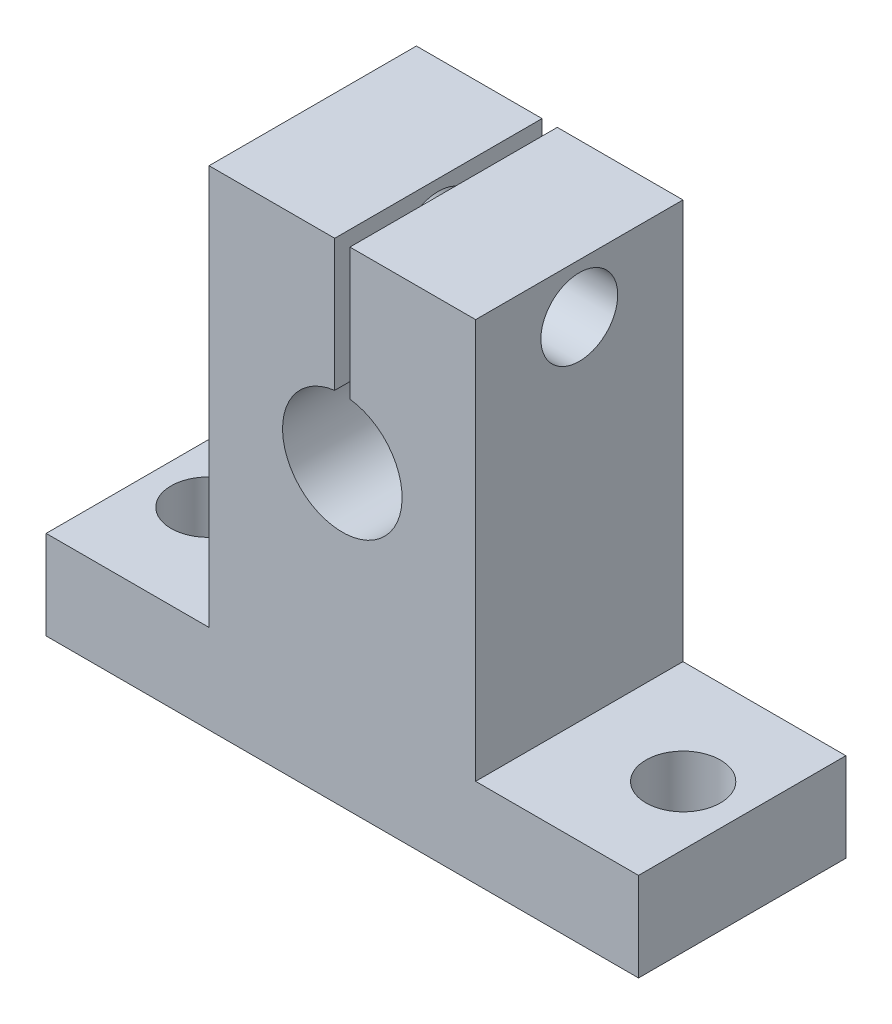
ISO-10303-21;
HEADER;
FILE_DESCRIPTION(('STEP AP214'),'2;1');
FILE_NAME('part.step','',(''),(''),'','','');
FILE_SCHEMA(('AUTOMOTIVE_DESIGN { 1 0 10303 214 1 1 1 1 }'));
ENDSEC;
DATA;
#1=APPLICATION_CONTEXT('core data for automotive mechanical design processes');
#2=APPLICATION_PROTOCOL_DEFINITION('international standard','automotive_design',2000,#1);
#3=PRODUCT_CONTEXT('',#1,'mechanical');
#4=PRODUCT('Part','Part','',(#3));
#5=PRODUCT_RELATED_PRODUCT_CATEGORY('part','',(#4));
#6=PRODUCT_DEFINITION_FORMATION('','',#4);
#7=PRODUCT_DEFINITION_CONTEXT('part definition',#1,'design');
#8=PRODUCT_DEFINITION('design','',#6,#7);
#9=PRODUCT_DEFINITION_SHAPE('','',#8);
#10=(LENGTH_UNIT() NAMED_UNIT(*) SI_UNIT(.MILLI.,.METRE.));
#11=(NAMED_UNIT(*) PLANE_ANGLE_UNIT() SI_UNIT($,.RADIAN.));
#12=(NAMED_UNIT(*) SI_UNIT($,.STERADIAN.) SOLID_ANGLE_UNIT());
#13=UNCERTAINTY_MEASURE_WITH_UNIT(LENGTH_MEASURE(1.E-05),#10,'distance_accuracy_value','');
#14=(GEOMETRIC_REPRESENTATION_CONTEXT(3) GLOBAL_UNCERTAINTY_ASSIGNED_CONTEXT((#13)) GLOBAL_UNIT_ASSIGNED_CONTEXT((#10,
#11,#12)) REPRESENTATION_CONTEXT('',''));
#15=CARTESIAN_POINT('',(0.,0.,0.));
#16=DIRECTION('',(0.,0.,1.));
#17=DIRECTION('',(1.,0.,0.));
#18=AXIS2_PLACEMENT_3D('',#15,#16,#17);
#19=CARTESIAN_POINT('',(-2.00038617608948,17.6991691104594,14.));
#20=DIRECTION('',(0.,1.,0.));
#21=DIRECTION('',(0.,0.,1.));
#22=AXIS2_PLACEMENT_3D('',#19,#20,#21);
#23=PLANE('',#22);
#24=DIRECTION('',(0.,0.,-1.));
#25=VECTOR('',#24,1.);
#26=CARTESIAN_POINT('',(7.51407649357905,17.6991691104594,14.));
#27=LINE('',#26,#25);
#28=CARTESIAN_POINT('',(7.51407649357905,17.6991691104594,14.));
#29=VERTEX_POINT('',#28);
#30=CARTESIAN_POINT('',(7.51407649357905,17.6991691104594,0.));
#31=VERTEX_POINT('',#30);
#32=EDGE_CURVE('E216',#29,#31,#27,.T.);
#33=ORIENTED_EDGE('',*,*,#32,.F.);
#34=DIRECTION('',(1.,0.,0.));
#35=VECTOR('',#34,1.);
#36=CARTESIAN_POINT('',(-2.00038617608948,17.6991691104594,14.));
#37=LINE('',#36,#35);
#38=CARTESIAN_POINT('',(15.9996138239105,17.6991691104594,14.));
#39=VERTEX_POINT('',#38);
#40=EDGE_CURVE('E132',#29,#39,#37,.T.);
#41=ORIENTED_EDGE('',*,*,#40,.T.);
#42=DIRECTION('',(0.,0.,-1.));
#43=VECTOR('',#42,1.);
#44=CARTESIAN_POINT('',(15.9996138239105,17.6991691104594,14.));
#45=LINE('',#44,#43);
#46=CARTESIAN_POINT('',(15.9996138239105,17.6991691104594,0.));
#47=VERTEX_POINT('',#46);
#48=EDGE_CURVE('E198',#39,#47,#45,.T.);
#49=ORIENTED_EDGE('',*,*,#48,.T.);
#50=DIRECTION('',(1.,0.,0.));
#51=VECTOR('',#50,1.);
#52=CARTESIAN_POINT('',(-2.00038617608948,17.6991691104594,0.));
#53=LINE('',#52,#51);
#54=EDGE_CURVE('E176',#31,#47,#53,.T.);
#55=ORIENTED_EDGE('',*,*,#54,.F.);
#56=EDGE_LOOP('',(#33,#41,#49,#55));
#57=FACE_BOUND('',#56,.T.);
#58=ADVANCED_FACE('F32',(#57),#23,.T.);
#59=CARTESIAN_POINT('',(26.9996138239105,-15.3008308895406,14.));
#60=DIRECTION('',(-1.,0.,0.));
#61=DIRECTION('',(0.,0.,1.));
#62=AXIS2_PLACEMENT_3D('',#59,#60,#61);
#63=PLANE('',#62);
#64=DIRECTION('',(0.,1.,0.));
#65=VECTOR('',#64,1.);
#66=CARTESIAN_POINT('',(26.9996138239105,-15.3008308895406,0.));
#67=LINE('',#66,#65);
#68=CARTESIAN_POINT('',(26.9996138239105,-15.3008308895406,0.));
#69=VERTEX_POINT('',#68);
#70=CARTESIAN_POINT('',(26.9996138239105,-9.30083088954057,0.));
#71=VERTEX_POINT('',#70);
#72=EDGE_CURVE('E139',#69,#71,#67,.T.);
#73=ORIENTED_EDGE('',*,*,#72,.T.);
#74=DIRECTION('',(0.,0.,-1.));
#75=VECTOR('',#74,1.);
#76=CARTESIAN_POINT('',(26.9996138239105,-9.30083088954057,14.));
#77=LINE('',#76,#75);
#78=CARTESIAN_POINT('',(26.9996138239105,-9.30083088954057,14.));
#79=VERTEX_POINT('',#78);
#80=EDGE_CURVE('E203',#79,#71,#77,.T.);
#81=ORIENTED_EDGE('',*,*,#80,.F.);
#82=DIRECTION('',(0.,1.,0.));
#83=VECTOR('',#82,1.);
#84=CARTESIAN_POINT('',(26.9996138239105,-15.3008308895406,14.));
#85=LINE('',#84,#83);
#86=CARTESIAN_POINT('',(26.9996138239105,-15.3008308895406,14.));
#87=VERTEX_POINT('',#86);
#88=EDGE_CURVE('E148',#87,#79,#85,.T.);
#89=ORIENTED_EDGE('',*,*,#88,.F.);
#90=DIRECTION('',(0.,0.,-1.));
#91=VECTOR('',#90,1.);
#92=CARTESIAN_POINT('',(26.9996138239105,-15.3008308895406,14.));
#93=LINE('',#92,#91);
#94=EDGE_CURVE('E205',#87,#69,#93,.T.);
#95=ORIENTED_EDGE('',*,*,#94,.T.);
#96=EDGE_LOOP('',(#73,#81,#89,#95));
#97=FACE_BOUND('',#96,.T.);
#98=ADVANCED_FACE('F34',(#97),#63,.F.);
#99=CARTESIAN_POINT('',(15.9996138239105,-9.30083088954057,14.));
#100=DIRECTION('',(0.,1.,0.));
#101=DIRECTION('',(0.,0.,1.));
#102=AXIS2_PLACEMENT_3D('',#99,#100,#101);
#103=PLANE('',#102);
#104=CARTESIAN_POINT('',(23.0145157220569,-9.30083088954057,7.));
#105=DIRECTION('',(0.,1.,0.));
#106=DIRECTION('',(0.,0.,1.));
#107=AXIS2_PLACEMENT_3D('',#104,#105,#106);
#108=CIRCLE('',#107,2.51486763293019);
#109=CARTESIAN_POINT('',(23.0145157220569,-9.30083088954057,9.51486763293019));
#110=VERTEX_POINT('',#109);
#111=EDGE_CURVE('E211',#110,#110,#108,.T.);
#112=ORIENTED_EDGE('',*,*,#111,.F.);
#113=EDGE_LOOP('',(#112));
#114=FACE_BOUND('',#113,.T.);
#115=DIRECTION('',(1.,0.,0.));
#116=VECTOR('',#115,1.);
#117=CARTESIAN_POINT('',(15.9996138239105,-9.30083088954057,0.));
#118=LINE('',#117,#116);
#119=CARTESIAN_POINT('',(15.9996138239105,-9.30083088954057,0.));
#120=VERTEX_POINT('',#119);
#121=EDGE_CURVE('E170',#120,#71,#118,.T.);
#122=ORIENTED_EDGE('',*,*,#121,.F.);
#123=DIRECTION('',(0.,0.,-1.));
#124=VECTOR('',#123,1.);
#125=CARTESIAN_POINT('',(15.9996138239105,-9.30083088954057,14.));
#126=LINE('',#125,#124);
#127=CARTESIAN_POINT('',(15.9996138239105,-9.30083088954057,14.));
#128=VERTEX_POINT('',#127);
#129=EDGE_CURVE('E201',#128,#120,#126,.T.);
#130=ORIENTED_EDGE('',*,*,#129,.F.);
#131=DIRECTION('',(1.,0.,0.));
#132=VECTOR('',#131,1.);
#133=CARTESIAN_POINT('',(15.9996138239105,-9.30083088954057,14.));
#134=LINE('',#133,#132);
#135=EDGE_CURVE('E151',#128,#79,#134,.T.);
#136=ORIENTED_EDGE('',*,*,#135,.T.);
#137=ORIENTED_EDGE('',*,*,#80,.T.);
#138=EDGE_LOOP('',(#122,#130,#136,#137));
#139=FACE_BOUND('',#138,.T.);
#140=ADVANCED_FACE('F261',(#114,#139),#103,.T.);
#141=CARTESIAN_POINT('',(15.9996138239105,17.6991691104594,14.));
#142=DIRECTION('',(1.,0.,0.));
#143=DIRECTION('',(0.,1.,0.));
#144=AXIS2_PLACEMENT_3D('',#141,#142,#143);
#145=PLANE('',#144);
#146=CARTESIAN_POINT('',(15.9996138239105,14.3512632276526,7.));
#147=DIRECTION('',(1.,0.,0.));
#148=DIRECTION('',(0.,1.,0.));
#149=AXIS2_PLACEMENT_3D('',#146,#147,#148);
#150=CIRCLE('',#149,2.5939753446912);
#151=CARTESIAN_POINT('',(15.9996138239105,11.7572878829614,7.));
#152=VERTEX_POINT('',#151);
#153=EDGE_CURVE('E133',#152,#152,#150,.T.);
#154=ORIENTED_EDGE('',*,*,#153,.F.);
#155=EDGE_LOOP('',(#154));
#156=FACE_BOUND('',#155,.T.);
#157=DIRECTION('',(0.,-1.,0.));
#158=VECTOR('',#157,1.);
#159=CARTESIAN_POINT('',(15.9996138239105,17.6991691104594,0.));
#160=LINE('',#159,#158);
#161=EDGE_CURVE('E173',#47,#120,#160,.T.);
#162=ORIENTED_EDGE('',*,*,#161,.F.);
#163=ORIENTED_EDGE('',*,*,#48,.F.);
#164=DIRECTION('',(0.,-1.,0.));
#165=VECTOR('',#164,1.);
#166=CARTESIAN_POINT('',(15.9996138239105,17.6991691104594,14.));
#167=LINE('',#166,#165);
#168=EDGE_CURVE('E154',#39,#128,#167,.T.);
#169=ORIENTED_EDGE('',*,*,#168,.T.);
#170=ORIENTED_EDGE('',*,*,#129,.T.);
#171=EDGE_LOOP('',(#162,#163,#169,#170));
#172=FACE_BOUND('',#171,.T.);
#173=ADVANCED_FACE('F267',(#156,#172),#145,.T.);
#174=DIRECTION('',(0.,0.,1.));
#175=VECTOR('',#174,1.);
#176=CARTESIAN_POINT('',(6.48515115424199,17.6991691104594,14.));
#177=LINE('',#176,#175);
#178=CARTESIAN_POINT('',(6.48515115424199,17.6991691104594,0.));
#179=VERTEX_POINT('',#178);
#180=CARTESIAN_POINT('',(6.48515115424199,17.6991691104594,14.));
#181=VERTEX_POINT('',#180);
#182=EDGE_CURVE('E220',#179,#181,#177,.T.);
#183=ORIENTED_EDGE('',*,*,#182,.F.);
#184=CARTESIAN_POINT('',(-2.00038617608948,17.6991691104594,0.));
#185=VERTEX_POINT('',#184);
#186=EDGE_CURVE('E177',#185,#179,#53,.T.);
#187=ORIENTED_EDGE('',*,*,#186,.F.);
#188=DIRECTION('',(0.,0.,-1.));
#189=VECTOR('',#188,1.);
#190=CARTESIAN_POINT('',(-2.00038617608948,17.6991691104594,14.));
#191=LINE('',#190,#189);
#192=CARTESIAN_POINT('',(-2.00038617608948,17.6991691104594,14.));
#193=VERTEX_POINT('',#192);
#194=EDGE_CURVE('E196',#193,#185,#191,.T.);
#195=ORIENTED_EDGE('',*,*,#194,.F.);
#196=EDGE_CURVE('E157',#193,#181,#37,.T.);
#197=ORIENTED_EDGE('',*,*,#196,.T.);
#198=EDGE_LOOP('',(#183,#187,#195,#197));
#199=FACE_BOUND('',#198,.T.);
#200=ADVANCED_FACE('F257',(#199),#23,.T.);
#201=CARTESIAN_POINT('',(-2.00038617608948,17.6991691104594,14.));
#202=DIRECTION('',(1.,0.,0.));
#203=DIRECTION('',(0.,1.,0.));
#204=AXIS2_PLACEMENT_3D('',#201,#202,#203);
#205=PLANE('',#204);
#206=CARTESIAN_POINT('',(-2.00038617608948,14.3512632276526,7.));
#207=DIRECTION('',(-1.,0.,0.));
#208=DIRECTION('',(0.,-1.,0.));
#209=AXIS2_PLACEMENT_3D('',#206,#207,#208);
#210=CIRCLE('',#209,2.5939753446912);
#211=CARTESIAN_POINT('',(-2.00038617608948,11.7572878829614,7.));
#212=VERTEX_POINT('',#211);
#213=EDGE_CURVE('E234',#212,#212,#210,.T.);
#214=ORIENTED_EDGE('',*,*,#213,.F.);
#215=EDGE_LOOP('',(#214));
#216=FACE_BOUND('',#215,.T.);
#217=DIRECTION('',(0.,-1.,0.));
#218=VECTOR('',#217,1.);
#219=CARTESIAN_POINT('',(-2.00038617608948,17.6991691104594,0.));
#220=LINE('',#219,#218);
#221=CARTESIAN_POINT('',(-2.00038617608948,-9.30083088954057,0.));
#222=VERTEX_POINT('',#221);
#223=EDGE_CURVE('E180',#185,#222,#220,.T.);
#224=ORIENTED_EDGE('',*,*,#223,.T.);
#225=DIRECTION('',(0.,0.,-1.));
#226=VECTOR('',#225,1.);
#227=CARTESIAN_POINT('',(-2.00038617608948,-9.30083088954057,14.));
#228=LINE('',#227,#226);
#229=CARTESIAN_POINT('',(-2.00038617608948,-9.30083088954057,14.));
#230=VERTEX_POINT('',#229);
#231=EDGE_CURVE('E193',#230,#222,#228,.T.);
#232=ORIENTED_EDGE('',*,*,#231,.F.);
#233=DIRECTION('',(0.,-1.,0.));
#234=VECTOR('',#233,1.);
#235=CARTESIAN_POINT('',(-2.00038617608948,17.6991691104594,14.));
#236=LINE('',#235,#234);
#237=EDGE_CURVE('E160',#193,#230,#236,.T.);
#238=ORIENTED_EDGE('',*,*,#237,.F.);
#239=ORIENTED_EDGE('',*,*,#194,.T.);
#240=EDGE_LOOP('',(#224,#232,#238,#239));
#241=FACE_BOUND('',#240,.T.);
#242=ADVANCED_FACE('F266',(#216,#241),#205,.F.);
#243=CARTESIAN_POINT('',(-2.00038617608948,-9.30083088954057,14.));
#244=DIRECTION('',(0.,-1.,0.));
#245=DIRECTION('',(0.,0.,-1.));
#246=AXIS2_PLACEMENT_3D('',#243,#244,#245);
#247=PLANE('',#246);
#248=CARTESIAN_POINT('',(-9.06576440971983,-9.30083088954057,7.));
#249=DIRECTION('',(0.,1.,0.));
#250=DIRECTION('',(0.,0.,1.));
#251=AXIS2_PLACEMENT_3D('',#248,#249,#250);
#252=CIRCLE('',#251,2.49774965335652);
#253=CARTESIAN_POINT('',(-9.06576440971983,-9.30083088954057,9.49774965335652));
#254=VERTEX_POINT('',#253);
#255=EDGE_CURVE('E142',#254,#254,#252,.T.);
#256=ORIENTED_EDGE('',*,*,#255,.F.);
#257=EDGE_LOOP('',(#256));
#258=FACE_BOUND('',#257,.T.);
#259=DIRECTION('',(-1.,0.,0.));
#260=VECTOR('',#259,1.);
#261=CARTESIAN_POINT('',(-2.00038617608948,-9.30083088954057,0.));
#262=LINE('',#261,#260);
#263=CARTESIAN_POINT('',(-13.0003861760895,-9.30083088954057,0.));
#264=VERTEX_POINT('',#263);
#265=EDGE_CURVE('E182',#222,#264,#262,.T.);
#266=ORIENTED_EDGE('',*,*,#265,.T.);
#267=DIRECTION('',(0.,0.,-1.));
#268=VECTOR('',#267,1.);
#269=CARTESIAN_POINT('',(-13.0003861760895,-9.30083088954057,14.));
#270=LINE('',#269,#268);
#271=CARTESIAN_POINT('',(-13.0003861760895,-9.30083088954057,14.));
#272=VERTEX_POINT('',#271);
#273=EDGE_CURVE('E191',#272,#264,#270,.T.);
#274=ORIENTED_EDGE('',*,*,#273,.F.);
#275=DIRECTION('',(-1.,0.,0.));
#276=VECTOR('',#275,1.);
#277=CARTESIAN_POINT('',(-2.00038617608948,-9.30083088954057,14.));
#278=LINE('',#277,#276);
#279=EDGE_CURVE('E162',#230,#272,#278,.T.);
#280=ORIENTED_EDGE('',*,*,#279,.F.);
#281=ORIENTED_EDGE('',*,*,#231,.T.);
#282=EDGE_LOOP('',(#266,#274,#280,#281));
#283=FACE_BOUND('',#282,.T.);
#284=ADVANCED_FACE('F273',(#258,#283),#247,.F.);
#285=CARTESIAN_POINT('',(-13.0003861760895,-15.3008308895406,14.));
#286=DIRECTION('',(-1.,0.,0.));
#287=DIRECTION('',(0.,0.,1.));
#288=AXIS2_PLACEMENT_3D('',#285,#286,#287);
#289=PLANE('',#288);
#290=DIRECTION('',(0.,1.,0.));
#291=VECTOR('',#290,1.);
#292=CARTESIAN_POINT('',(-13.0003861760895,-15.3008308895406,0.));
#293=LINE('',#292,#291);
#294=CARTESIAN_POINT('',(-13.0003861760895,-15.3008308895406,0.));
#295=VERTEX_POINT('',#294);
#296=EDGE_CURVE('E185',#295,#264,#293,.T.);
#297=ORIENTED_EDGE('',*,*,#296,.F.);
#298=DIRECTION('',(0.,0.,-1.));
#299=VECTOR('',#298,1.);
#300=CARTESIAN_POINT('',(-13.0003861760895,-15.3008308895406,14.));
#301=LINE('',#300,#299);
#302=CARTESIAN_POINT('',(-13.0003861760895,-15.3008308895406,14.));
#303=VERTEX_POINT('',#302);
#304=EDGE_CURVE('E167',#303,#295,#301,.T.);
#305=ORIENTED_EDGE('',*,*,#304,.F.);
#306=DIRECTION('',(0.,1.,0.));
#307=VECTOR('',#306,1.);
#308=CARTESIAN_POINT('',(-13.0003861760895,-15.3008308895406,14.));
#309=LINE('',#308,#307);
#310=EDGE_CURVE('E164',#303,#272,#309,.T.);
#311=ORIENTED_EDGE('',*,*,#310,.T.);
#312=ORIENTED_EDGE('',*,*,#273,.T.);
#313=EDGE_LOOP('',(#297,#305,#311,#312));
#314=FACE_BOUND('',#313,.T.);
#315=ADVANCED_FACE('F294',(#314),#289,.T.);
#316=CARTESIAN_POINT('',(-2.00038617608948,-15.3008308895406,14.));
#317=DIRECTION('',(0.,-1.,0.));
#318=DIRECTION('',(1.,0.,0.));
#319=AXIS2_PLACEMENT_3D('',#316,#317,#318);
#320=PLANE('',#319);
#321=CARTESIAN_POINT('',(23.0145157220569,-15.3008308895406,7.));
#322=DIRECTION('',(0.,-1.,0.));
#323=DIRECTION('',(1.,0.,0.));
#324=AXIS2_PLACEMENT_3D('',#321,#322,#323);
#325=CIRCLE('',#324,2.51486763293019);
#326=CARTESIAN_POINT('',(25.5293833549871,-15.3008308895406,7.));
#327=VERTEX_POINT('',#326);
#328=EDGE_CURVE('E208',#327,#327,#325,.T.);
#329=ORIENTED_EDGE('',*,*,#328,.F.);
#330=EDGE_LOOP('',(#329));
#331=FACE_BOUND('',#330,.T.);
#332=CARTESIAN_POINT('',(-9.06576440971983,-15.3008308895406,7.));
#333=DIRECTION('',(0.,-1.,0.));
#334=DIRECTION('',(1.,0.,0.));
#335=AXIS2_PLACEMENT_3D('',#332,#333,#334);
#336=CIRCLE('',#335,2.49774965335652);
#337=CARTESIAN_POINT('',(-6.56801475636332,-15.3008308895406,7.));
#338=VERTEX_POINT('',#337);
#339=EDGE_CURVE('E137',#338,#338,#336,.T.);
#340=ORIENTED_EDGE('',*,*,#339,.F.);
#341=EDGE_LOOP('',(#340));
#342=FACE_BOUND('',#341,.T.);
#343=DIRECTION('',(-1.,0.,0.));
#344=VECTOR('',#343,1.);
#345=CARTESIAN_POINT('',(-2.00038617608948,-15.3008308895406,0.));
#346=LINE('',#345,#344);
#347=EDGE_CURVE('E149',#69,#295,#346,.T.);
#348=ORIENTED_EDGE('',*,*,#347,.F.);
#349=ORIENTED_EDGE('',*,*,#94,.F.);
#350=DIRECTION('',(1.,0.,0.));
#351=VECTOR('',#350,1.);
#352=CARTESIAN_POINT('',(-2.00038617608948,-15.3008308895406,14.));
#353=LINE('',#352,#351);
#354=EDGE_CURVE('E146',#303,#87,#353,.T.);
#355=ORIENTED_EDGE('',*,*,#354,.F.);
#356=ORIENTED_EDGE('',*,*,#304,.T.);
#357=EDGE_LOOP('',(#348,#349,#355,#356));
#358=FACE_BOUND('',#357,.T.);
#359=ADVANCED_FACE('F296',(#331,#342,#358),#320,.T.);
#360=CARTESIAN_POINT('',(0.,0.,14.));
#361=DIRECTION('',(0.,0.,1.));
#362=DIRECTION('',(1.,0.,0.));
#363=AXIS2_PLACEMENT_3D('',#360,#361,#362);
#364=PLANE('',#363);
#365=DIRECTION('',(0.,1.,0.));
#366=VECTOR('',#365,1.);
#367=CARTESIAN_POINT('',(7.51407649357905,18.6554074490735,14.));
#368=LINE('',#367,#366);
#369=CARTESIAN_POINT('',(7.51407649357905,8.80582091431047,14.));
#370=VERTEX_POINT('',#369);
#371=EDGE_CURVE('E120',#370,#29,#368,.T.);
#372=ORIENTED_EDGE('',*,*,#371,.F.);
#373=CARTESIAN_POINT('',(6.99961382391052,4.80309765097786,14.));
#374=DIRECTION('',(0.,0.,1.));
#375=DIRECTION('',(1.,0.,0.));
#376=AXIS2_PLACEMENT_3D('',#373,#374,#375);
#377=CIRCLE('',#376,4.03564931099154);
#378=CARTESIAN_POINT('',(6.48515115424199,8.80582091431047,14.));
#379=VERTEX_POINT('',#378);
#380=EDGE_CURVE('E130',#379,#370,#377,.T.);
#381=ORIENTED_EDGE('',*,*,#380,.F.);
#382=DIRECTION('',(0.,-1.,0.));
#383=VECTOR('',#382,1.);
#384=CARTESIAN_POINT('',(6.48515115424199,18.6554074490735,14.));
#385=LINE('',#384,#383);
#386=EDGE_CURVE('E48',#181,#379,#385,.T.);
#387=ORIENTED_EDGE('',*,*,#386,.F.);
#388=ORIENTED_EDGE('',*,*,#196,.F.);
#389=ORIENTED_EDGE('',*,*,#237,.T.);
#390=ORIENTED_EDGE('',*,*,#279,.T.);
#391=ORIENTED_EDGE('',*,*,#310,.F.);
#392=ORIENTED_EDGE('',*,*,#354,.T.);
#393=ORIENTED_EDGE('',*,*,#88,.T.);
#394=ORIENTED_EDGE('',*,*,#135,.F.);
#395=ORIENTED_EDGE('',*,*,#168,.F.);
#396=ORIENTED_EDGE('',*,*,#40,.F.);
#397=EDGE_LOOP('',(#372,#381,#387,#388,#389,#390,#391,#392,#393,#394,#395,#396));
#398=FACE_BOUND('',#397,.T.);
#399=ADVANCED_FACE('F129',(#398),#364,.T.);
#400=CARTESIAN_POINT('',(0.,0.,0.));
#401=DIRECTION('',(0.,0.,1.));
#402=DIRECTION('',(1.,0.,0.));
#403=AXIS2_PLACEMENT_3D('',#400,#401,#402);
#404=PLANE('',#403);
#405=CARTESIAN_POINT('',(6.99961382391052,4.80309765097786,0.));
#406=DIRECTION('',(0.,0.,1.));
#407=DIRECTION('',(1.,0.,0.));
#408=AXIS2_PLACEMENT_3D('',#405,#406,#407);
#409=CIRCLE('',#408,4.03564931099154);
#410=CARTESIAN_POINT('',(6.48515115424199,8.80582091431047,0.));
#411=VERTEX_POINT('',#410);
#412=CARTESIAN_POINT('',(7.51407649357905,8.80582091431047,0.));
#413=VERTEX_POINT('',#412);
#414=EDGE_CURVE('E136',#411,#413,#409,.T.);
#415=ORIENTED_EDGE('',*,*,#414,.T.);
#416=DIRECTION('',(0.,1.,0.));
#417=VECTOR('',#416,1.);
#418=CARTESIAN_POINT('',(7.51407649357905,18.6554074490735,0.));
#419=LINE('',#418,#417);
#420=EDGE_CURVE('E56',#413,#31,#419,.T.);
#421=ORIENTED_EDGE('',*,*,#420,.T.);
#422=ORIENTED_EDGE('',*,*,#54,.T.);
#423=ORIENTED_EDGE('',*,*,#161,.T.);
#424=ORIENTED_EDGE('',*,*,#121,.T.);
#425=ORIENTED_EDGE('',*,*,#72,.F.);
#426=ORIENTED_EDGE('',*,*,#347,.T.);
#427=ORIENTED_EDGE('',*,*,#296,.T.);
#428=ORIENTED_EDGE('',*,*,#265,.F.);
#429=ORIENTED_EDGE('',*,*,#223,.F.);
#430=ORIENTED_EDGE('',*,*,#186,.T.);
#431=DIRECTION('',(0.,-1.,0.));
#432=VECTOR('',#431,1.);
#433=CARTESIAN_POINT('',(6.48515115424199,18.6554074490735,0.));
#434=LINE('',#433,#432);
#435=EDGE_CURVE('E224',#179,#411,#434,.T.);
#436=ORIENTED_EDGE('',*,*,#435,.T.);
#437=EDGE_LOOP('',(#415,#421,#422,#423,#424,#425,#426,#427,#428,#429,#430,#436));
#438=FACE_BOUND('',#437,.T.);
#439=ADVANCED_FACE('F281',(#438),#404,.F.);
#440=CARTESIAN_POINT('',(6.99961382391052,4.80309765097786,0.));
#441=DIRECTION('',(0.,0.,1.));
#442=DIRECTION('',(1.,0.,0.));
#443=AXIS2_PLACEMENT_3D('',#440,#441,#442);
#444=CYLINDRICAL_SURFACE('',#443,4.03564931099154);
#445=ORIENTED_EDGE('',*,*,#380,.T.);
#446=DIRECTION('',(0.,0.,1.));
#447=VECTOR('',#446,1.);
#448=CARTESIAN_POINT('',(7.51407649357905,8.80582091431047,0.));
#449=LINE('',#448,#447);
#450=EDGE_CURVE('E11',#370,#413,#449,.F.);
#451=ORIENTED_EDGE('',*,*,#450,.T.);
#452=ORIENTED_EDGE('',*,*,#414,.F.);
#453=DIRECTION('',(0.,0.,1.));
#454=VECTOR('',#453,1.);
#455=CARTESIAN_POINT('',(6.48515115424199,8.80582091431047,0.));
#456=LINE('',#455,#454);
#457=EDGE_CURVE('E41',#411,#379,#456,.T.);
#458=ORIENTED_EDGE('',*,*,#457,.T.);
#459=EDGE_LOOP('',(#445,#451,#452,#458));
#460=FACE_BOUND('',#459,.T.);
#461=ADVANCED_FACE('F135',(#460),#444,.F.);
#462=CARTESIAN_POINT('',(-9.06576440971983,-23.3008308895406,7.));
#463=DIRECTION('',(0.,1.,0.));
#464=DIRECTION('',(0.,0.,1.));
#465=AXIS2_PLACEMENT_3D('',#462,#463,#464);
#466=CYLINDRICAL_SURFACE('',#465,2.49774965335652);
#467=ORIENTED_EDGE('',*,*,#339,.T.);
#468=EDGE_LOOP('',(#467));
#469=FACE_BOUND('',#468,.T.);
#470=ORIENTED_EDGE('',*,*,#255,.T.);
#471=EDGE_LOOP('',(#470));
#472=FACE_BOUND('',#471,.T.);
#473=ADVANCED_FACE('F367',(#469,#472),#466,.F.);
#474=CARTESIAN_POINT('',(23.0145157220569,-23.3008308895406,7.));
#475=DIRECTION('',(0.,1.,0.));
#476=DIRECTION('',(0.,0.,1.));
#477=AXIS2_PLACEMENT_3D('',#474,#475,#476);
#478=CYLINDRICAL_SURFACE('',#477,2.51486763293019);
#479=ORIENTED_EDGE('',*,*,#328,.T.);
#480=EDGE_LOOP('',(#479));
#481=FACE_BOUND('',#480,.T.);
#482=ORIENTED_EDGE('',*,*,#111,.T.);
#483=EDGE_LOOP('',(#482));
#484=FACE_BOUND('',#483,.T.);
#485=ADVANCED_FACE('F342',(#481,#484),#478,.F.);
#486=CARTESIAN_POINT('',(6.48515115424199,18.6554074490735,0.));
#487=DIRECTION('',(-1.,0.,0.));
#488=DIRECTION('',(0.,0.,1.));
#489=AXIS2_PLACEMENT_3D('',#486,#487,#488);
#490=PLANE('',#489);
#491=CARTESIAN_POINT('',(6.48515115424199,14.3512632276526,7.));
#492=DIRECTION('',(-1.,0.,0.));
#493=DIRECTION('',(0.,0.,1.));
#494=AXIS2_PLACEMENT_3D('',#491,#492,#493);
#495=CIRCLE('',#494,2.5939753446912);
#496=CARTESIAN_POINT('',(6.48515115424199,11.7572878829614,7.));
#497=VERTEX_POINT('',#496);
#498=EDGE_CURVE('E231',#497,#497,#495,.T.);
#499=ORIENTED_EDGE('',*,*,#498,.T.);
#500=EDGE_LOOP('',(#499));
#501=FACE_BOUND('',#500,.T.);
#502=ORIENTED_EDGE('',*,*,#182,.T.);
#503=ORIENTED_EDGE('',*,*,#386,.T.);
#504=ORIENTED_EDGE('',*,*,#457,.F.);
#505=ORIENTED_EDGE('',*,*,#435,.F.);
#506=EDGE_LOOP('',(#502,#503,#504,#505));
#507=FACE_BOUND('',#506,.T.);
#508=ADVANCED_FACE('F251',(#501,#507),#490,.F.);
#509=CARTESIAN_POINT('',(7.51407649357905,18.6554074490735,0.));
#510=DIRECTION('',(1.,0.,0.));
#511=DIRECTION('',(0.,0.,-1.));
#512=AXIS2_PLACEMENT_3D('',#509,#510,#511);
#513=PLANE('',#512);
#514=CARTESIAN_POINT('',(7.51407649357905,14.3512632276526,7.));
#515=DIRECTION('',(1.,0.,0.));
#516=DIRECTION('',(0.,0.,-1.));
#517=AXIS2_PLACEMENT_3D('',#514,#515,#516);
#518=CIRCLE('',#517,2.5939753446912);
#519=CARTESIAN_POINT('',(7.51407649357905,11.7572878829614,7.));
#520=VERTEX_POINT('',#519);
#521=EDGE_CURVE('E36',#520,#520,#518,.T.);
#522=ORIENTED_EDGE('',*,*,#521,.T.);
#523=EDGE_LOOP('',(#522));
#524=FACE_BOUND('',#523,.T.);
#525=ORIENTED_EDGE('',*,*,#32,.T.);
#526=ORIENTED_EDGE('',*,*,#420,.F.);
#527=ORIENTED_EDGE('',*,*,#450,.F.);
#528=ORIENTED_EDGE('',*,*,#371,.T.);
#529=EDGE_LOOP('',(#525,#526,#527,#528));
#530=FACE_BOUND('',#529,.T.);
#531=ADVANCED_FACE('F119',(#524,#530),#513,.F.);
#532=CARTESIAN_POINT('',(26.9996138239105,14.3512632276526,7.));
#533=DIRECTION('',(-1.,0.,0.));
#534=DIRECTION('',(0.,-1.,0.));
#535=AXIS2_PLACEMENT_3D('',#532,#533,#534);
#536=CYLINDRICAL_SURFACE('',#535,2.5939753446912);
#537=CARTESIAN_POINT('',(15.9996138239105,11.7572878829614,7.));
#538=CARTESIAN_POINT('',(15.9112228100529,11.7572878829614,7.));
#539=CARTESIAN_POINT('',(15.8228317961953,11.7572878829614,7.));
#540=CARTESIAN_POINT('',(15.64604976848,11.7572878829614,7.));
#541=CARTESIAN_POINT('',(15.5576587546224,11.7572878829614,7.));
#542=CARTESIAN_POINT('',(15.3808767269072,11.7572878829614,7.));
#543=CARTESIAN_POINT('',(15.2924857130496,11.7572878829614,7.));
#544=CARTESIAN_POINT('',(15.1157036853343,11.7572878829614,7.));
#545=CARTESIAN_POINT('',(15.0273126714767,11.7572878829614,7.));
#546=CARTESIAN_POINT('',(14.8505306437615,11.7572878829614,7.));
#547=CARTESIAN_POINT('',(14.7621396299038,11.7572878829614,7.));
#548=CARTESIAN_POINT('',(14.5853576021886,11.7572878829614,7.));
#549=CARTESIAN_POINT('',(14.496966588331,11.7572878829614,7.));
#550=CARTESIAN_POINT('',(14.3201845606157,11.7572878829614,7.));
#551=CARTESIAN_POINT('',(14.2317935467581,11.7572878829614,7.));
#552=CARTESIAN_POINT('',(14.0550115190429,11.7572878829614,7.));
#553=CARTESIAN_POINT('',(13.9666205051853,11.7572878829614,7.));
#554=CARTESIAN_POINT('',(13.78983847747,11.7572878829614,7.));
#555=CARTESIAN_POINT('',(13.7014474636124,11.7572878829614,7.));
#556=CARTESIAN_POINT('',(13.5246654358972,11.7572878829614,7.));
#557=CARTESIAN_POINT('',(13.4362744220396,11.7572878829614,7.));
#558=CARTESIAN_POINT('',(13.2594923943243,11.7572878829614,7.));
#559=CARTESIAN_POINT('',(13.1711013804667,11.7572878829614,7.));
#560=CARTESIAN_POINT('',(12.9943193527515,11.7572878829614,7.));
#561=CARTESIAN_POINT('',(12.9059283388938,11.7572878829614,7.));
#562=CARTESIAN_POINT('',(12.7291463111786,11.7572878829614,7.));
#563=CARTESIAN_POINT('',(12.640755297321,11.7572878829614,7.));
#564=CARTESIAN_POINT('',(12.4639732696057,11.7572878829614,7.));
#565=CARTESIAN_POINT('',(12.3755822557481,11.7572878829614,7.));
#566=CARTESIAN_POINT('',(12.1988002280329,11.7572878829614,7.));
#567=CARTESIAN_POINT('',(12.1104092141753,11.7572878829614,7.));
#568=CARTESIAN_POINT('',(11.93362718646,11.7572878829614,7.));
#569=CARTESIAN_POINT('',(11.8452361726024,11.7572878829614,7.));
#570=CARTESIAN_POINT('',(11.6684541448872,11.7572878829614,7.));
#571=CARTESIAN_POINT('',(11.5800631310295,11.7572878829614,7.));
#572=CARTESIAN_POINT('',(11.4032811033143,11.7572878829614,7.));
#573=CARTESIAN_POINT('',(11.3148900894567,11.7572878829614,7.));
#574=CARTESIAN_POINT('',(11.1381080617414,11.7572878829614,7.));
#575=CARTESIAN_POINT('',(11.0497170478838,11.7572878829614,7.));
#576=CARTESIAN_POINT('',(10.8729350201686,11.7572878829614,7.));
#577=CARTESIAN_POINT('',(10.784544006311,11.7572878829614,7.));
#578=CARTESIAN_POINT('',(10.6077619785957,11.7572878829614,7.));
#579=CARTESIAN_POINT('',(10.5193709647381,11.7572878829614,7.));
#580=CARTESIAN_POINT('',(10.3425889370229,11.7572878829614,7.));
#581=CARTESIAN_POINT('',(10.2541979231653,11.7572878829614,7.));
#582=CARTESIAN_POINT('',(10.07741589545,11.7572878829614,7.));
#583=CARTESIAN_POINT('',(9.98902488159239,11.7572878829614,7.));
#584=CARTESIAN_POINT('',(9.81224285387715,11.7572878829614,7.));
#585=CARTESIAN_POINT('',(9.72385184001953,11.7572878829614,7.));
#586=CARTESIAN_POINT('',(9.5470698123043,11.7572878829614,7.));
#587=CARTESIAN_POINT('',(9.45867879844668,11.7572878829614,7.));
#588=CARTESIAN_POINT('',(9.28189677073144,11.7572878829614,7.));
#589=CARTESIAN_POINT('',(9.19350575687382,11.7572878829614,7.));
#590=CARTESIAN_POINT('',(9.01672372915858,11.7572878829614,7.));
#591=CARTESIAN_POINT('',(8.92833271530096,11.7572878829614,7.));
#592=CARTESIAN_POINT('',(8.75155068758572,11.7572878829614,7.));
#593=CARTESIAN_POINT('',(8.6631596737281,11.7572878829614,7.));
#594=CARTESIAN_POINT('',(8.48637764601286,11.7572878829614,7.));
#595=CARTESIAN_POINT('',(8.39798663215524,11.7572878829614,7.));
#596=CARTESIAN_POINT('',(8.22120460444,11.7572878829614,7.));
#597=CARTESIAN_POINT('',(8.13281359058238,11.7572878829614,7.));
#598=CARTESIAN_POINT('',(7.95603156286714,11.7572878829614,7.));
#599=CARTESIAN_POINT('',(7.86764054900952,11.7572878829614,7.));
#600=CARTESIAN_POINT('',(7.69085852129428,11.7572878829614,7.));
#601=CARTESIAN_POINT('',(7.60246750743667,11.7572878829614,7.));
#602=CARTESIAN_POINT('',(7.51407649357905,11.7572878829614,7.));
#603=B_SPLINE_CURVE_WITH_KNOTS('',3,(#537,#538,#539,#540,#541,#542,#543,#544,#545,#546,#547,
#548,#549,#550,#551,#552,#553,#554,#555,#556,#557,#558,#559,#560,#561,#562,#563,#564,#565,#566,
#567,#568,#569,#570,#571,#572,#573,#574,#575,#576,#577,#578,#579,#580,#581,#582,#583,#584,#585,
#586,#587,#588,#589,#590,#591,#592,#593,#594,#595,#596,#597,#598,#599,#600,#601,#602),
.UNSPECIFIED.,.F.,.F.,(4,2,2,2,2,2,2,2,2,2,2,2,2,2,2,2,2,2,2,2,2,2,2,2,2,2,2,2,2,2,2,2,4),(0.,
0.26517304157286,0.530346083145719,0.795519124718577,1.06069216629144,1.32586520786429,
1.59103824943715,1.85621129101001,2.12138433258287,2.38655737415573,2.65173041572859,
2.91690345730145,3.1820764988743,3.44724954044716,3.71242258202002,3.97759562359288,
4.24276866516574,4.5079417067386,4.77311474831145,5.03828778988431,5.30346083145717,
5.56863387303003,5.83380691460289,6.09897995617575,6.3641529977486,6.62932603932146,
6.89449908089432,7.15967212246718,7.42484516404004,7.69001820561289,7.95519124718575,
8.22036428875862,8.48553733033147),.UNSPECIFIED.);
#604=EDGE_CURVE('BSEAM242',#152,#520,#603,.T.);
#605=ORIENTED_EDGE('',*,*,#153,.T.);
#606=ORIENTED_EDGE('',*,*,#521,.F.);
#607=ORIENTED_EDGE('',*,*,#604,.T.);
#608=ORIENTED_EDGE('',*,*,#604,.F.);
#609=EDGE_LOOP('',(#605,#607,#606,#608));
#610=FACE_BOUND('',#609,.T.);
#611=ADVANCED_FACE('F242',(#610),#536,.F.);
#612=CARTESIAN_POINT('',(-2.00038617608948,11.7572878829614,7.));
#613=CARTESIAN_POINT('',(-1.91199516223186,11.7572878829614,7.));
#614=CARTESIAN_POINT('',(-1.82360414837425,11.7572878829614,7.));
#615=CARTESIAN_POINT('',(-1.64682212065901,11.7572878829614,7.));
#616=CARTESIAN_POINT('',(-1.55843110680139,11.7572878829614,7.));
#617=CARTESIAN_POINT('',(-1.38164907908615,11.7572878829614,7.));
#618=CARTESIAN_POINT('',(-1.29325806522853,11.7572878829614,7.));
#619=CARTESIAN_POINT('',(-1.11647603751329,11.7572878829614,7.));
#620=CARTESIAN_POINT('',(-1.02808502365567,11.7572878829614,7.));
#621=CARTESIAN_POINT('',(-0.85130299594043,11.7572878829614,7.));
#622=CARTESIAN_POINT('',(-0.762911982082811,11.7572878829614,7.));
#623=CARTESIAN_POINT('',(-0.586129954367572,11.7572878829614,7.));
#624=CARTESIAN_POINT('',(-0.497738940509952,11.7572878829614,7.));
#625=CARTESIAN_POINT('',(-0.320956912794712,11.7572878829614,7.));
#626=CARTESIAN_POINT('',(-0.232565898937092,11.7572878829614,7.));
#627=CARTESIAN_POINT('',(-0.055783871221853,11.7572878829614,7.));
#628=CARTESIAN_POINT('',(0.0326071426357659,11.7572878829614,7.));
#629=CARTESIAN_POINT('',(0.209389170351004,11.7572878829614,7.));
#630=CARTESIAN_POINT('',(0.297780184208623,11.7572878829614,7.));
#631=CARTESIAN_POINT('',(0.474562211923862,11.7572878829614,7.));
#632=CARTESIAN_POINT('',(0.562953225781482,11.7572878829614,7.));
#633=CARTESIAN_POINT('',(0.739735253496722,11.7572878829614,7.));
#634=CARTESIAN_POINT('',(0.828126267354342,11.7572878829614,7.));
#635=CARTESIAN_POINT('',(1.00490829506958,11.7572878829614,7.));
#636=CARTESIAN_POINT('',(1.0932993089272,11.7572878829614,7.));
#637=CARTESIAN_POINT('',(1.27008133664244,11.7572878829614,7.));
#638=CARTESIAN_POINT('',(1.35847235050006,11.7572878829614,7.));
#639=CARTESIAN_POINT('',(1.5352543782153,11.7572878829614,7.));
#640=CARTESIAN_POINT('',(1.62364539207292,11.7572878829614,7.));
#641=CARTESIAN_POINT('',(1.80042741978816,11.7572878829614,7.));
#642=CARTESIAN_POINT('',(1.88881843364578,11.7572878829614,7.));
#643=CARTESIAN_POINT('',(2.06560046136102,11.7572878829614,7.));
#644=CARTESIAN_POINT('',(2.15399147521863,11.7572878829614,7.));
#645=CARTESIAN_POINT('',(2.33077350293387,11.7572878829614,7.));
#646=CARTESIAN_POINT('',(2.41916451679149,11.7572878829614,7.));
#647=CARTESIAN_POINT('',(2.59594654450673,11.7572878829614,7.));
#648=CARTESIAN_POINT('',(2.68433755836435,11.7572878829614,7.));
#649=CARTESIAN_POINT('',(2.86111958607959,11.7572878829614,7.));
#650=CARTESIAN_POINT('',(2.94951059993721,11.7572878829614,7.));
#651=CARTESIAN_POINT('',(3.12629262765245,11.7572878829614,7.));
#652=CARTESIAN_POINT('',(3.21468364151007,11.7572878829614,7.));
#653=CARTESIAN_POINT('',(3.39146566922531,11.7572878829614,7.));
#654=CARTESIAN_POINT('',(3.47985668308292,11.7572878829614,7.));
#655=CARTESIAN_POINT('',(3.65663871079816,11.7572878829614,7.));
#656=CARTESIAN_POINT('',(3.74502972465578,11.7572878829614,7.));
#657=CARTESIAN_POINT('',(3.92181175237102,11.7572878829614,7.));
#658=CARTESIAN_POINT('',(4.01020276622864,11.7572878829614,7.));
#659=CARTESIAN_POINT('',(4.18698479394388,11.7572878829614,7.));
#660=CARTESIAN_POINT('',(4.2753758078015,11.7572878829614,7.));
#661=CARTESIAN_POINT('',(4.45215783551674,11.7572878829614,7.));
#662=CARTESIAN_POINT('',(4.54054884937436,11.7572878829614,7.));
#663=CARTESIAN_POINT('',(4.7173308770896,11.7572878829614,7.));
#664=CARTESIAN_POINT('',(4.80572189094722,11.7572878829614,7.));
#665=CARTESIAN_POINT('',(4.98250391866246,11.7572878829614,7.));
#666=CARTESIAN_POINT('',(5.07089493252008,11.7572878829614,7.));
#667=CARTESIAN_POINT('',(5.24767696023532,11.7572878829614,7.));
#668=CARTESIAN_POINT('',(5.33606797409294,11.7572878829614,7.));
#669=CARTESIAN_POINT('',(5.51285000180817,11.7572878829614,7.));
#670=CARTESIAN_POINT('',(5.60124101566579,11.7572878829614,7.));
#671=CARTESIAN_POINT('',(5.77802304338103,11.7572878829614,7.));
#672=CARTESIAN_POINT('',(5.86641405723865,11.7572878829614,7.));
#673=CARTESIAN_POINT('',(6.04319608495389,11.7572878829614,7.));
#674=CARTESIAN_POINT('',(6.13158709881151,11.7572878829614,7.));
#675=CARTESIAN_POINT('',(6.30836912652675,11.7572878829614,7.));
#676=CARTESIAN_POINT('',(6.39676014038437,11.7572878829614,7.));
#677=CARTESIAN_POINT('',(6.48515115424199,11.7572878829614,7.));
#678=B_SPLINE_CURVE_WITH_KNOTS('',3,(#612,#613,#614,#615,#616,#617,#618,#619,#620,#621,#622,
#623,#624,#625,#626,#627,#628,#629,#630,#631,#632,#633,#634,#635,#636,#637,#638,#639,#640,#641,
#642,#643,#644,#645,#646,#647,#648,#649,#650,#651,#652,#653,#654,#655,#656,#657,#658,#659,#660,
#661,#662,#663,#664,#665,#666,#667,#668,#669,#670,#671,#672,#673,#674,#675,#676,#677),
.UNSPECIFIED.,.F.,.F.,(4,2,2,2,2,2,2,2,2,2,2,2,2,2,2,2,2,2,2,2,2,2,2,2,2,2,2,2,2,2,2,2,4),(0.,
0.265173041572857,0.530346083145717,0.795519124718577,1.06069216629143,1.32586520786429,
1.59103824943715,1.85621129101001,2.12138433258287,2.38655737415572,2.65173041572859,
2.91690345730145,3.1820764988743,3.44724954044716,3.71242258202002,3.97759562359288,
4.24276866516574,4.50794170673859,4.77311474831145,5.03828778988431,5.30346083145717,
5.56863387303003,5.83380691460289,6.09897995617575,6.3641529977486,6.62932603932146,
6.89449908089432,7.15967212246718,7.42484516404004,7.69001820561289,7.95519124718575,
8.22036428875862,8.48553733033147),.UNSPECIFIED.);
#679=EDGE_CURVE('BSEAM244',#212,#497,#678,.T.);
#680=ORIENTED_EDGE('',*,*,#213,.T.);
#681=ORIENTED_EDGE('',*,*,#498,.F.);
#682=ORIENTED_EDGE('',*,*,#679,.T.);
#683=ORIENTED_EDGE('',*,*,#679,.F.);
#684=EDGE_LOOP('',(#680,#682,#681,#683));
#685=FACE_BOUND('',#684,.T.);
#686=ADVANCED_FACE('F244',(#685),#536,.F.);
#687=CLOSED_SHELL('',(#58,#98,#140,#173,#200,#242,#284,#315,#359,#399,#439,#461,#473,#485,#508,
#531,#611,#686));
#688=MANIFOLD_SOLID_BREP('B2',#687);
#689=ADVANCED_BREP_SHAPE_REPRESENTATION('',(#18,#688),#14);
#690=SHAPE_DEFINITION_REPRESENTATION(#9,#689);
ENDSEC;
END-ISO-10303-21;
